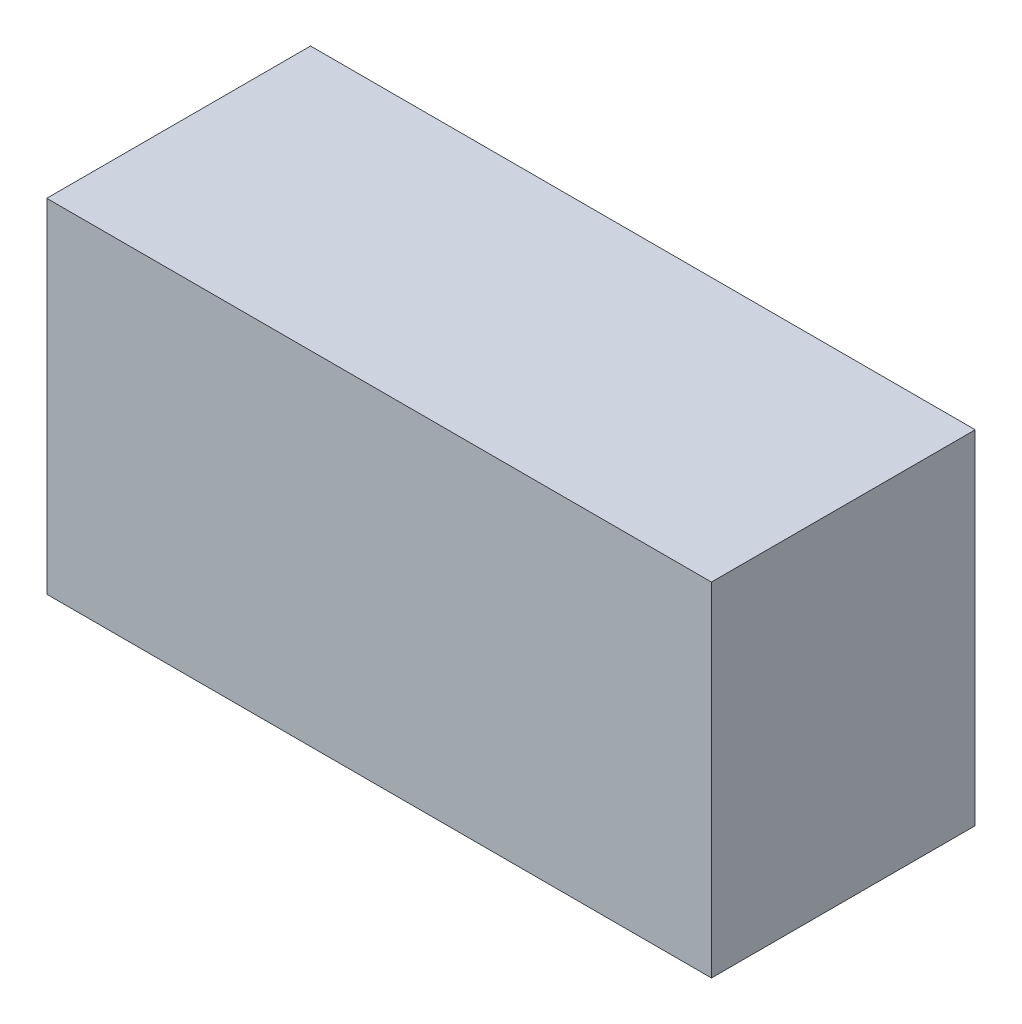
ISO-10303-21;
HEADER;
FILE_DESCRIPTION(('STEP AP214'),'2;1');
FILE_NAME('part.step','',(''),(''),'','','');
FILE_SCHEMA(('AUTOMOTIVE_DESIGN { 1 0 10303 214 1 1 1 1 }'));
ENDSEC;
DATA;
#1=APPLICATION_CONTEXT('core data for automotive mechanical design processes');
#2=APPLICATION_PROTOCOL_DEFINITION('international standard','automotive_design',2000,#1);
#3=PRODUCT_CONTEXT('',#1,'mechanical');
#4=PRODUCT('Part','Part','',(#3));
#5=PRODUCT_RELATED_PRODUCT_CATEGORY('part','',(#4));
#6=PRODUCT_DEFINITION_FORMATION('','',#4);
#7=PRODUCT_DEFINITION_CONTEXT('part definition',#1,'design');
#8=PRODUCT_DEFINITION('design','',#6,#7);
#9=PRODUCT_DEFINITION_SHAPE('','',#8);
#10=(LENGTH_UNIT() NAMED_UNIT(*) SI_UNIT(.MILLI.,.METRE.));
#11=(NAMED_UNIT(*) PLANE_ANGLE_UNIT() SI_UNIT($,.RADIAN.));
#12=(NAMED_UNIT(*) SI_UNIT($,.STERADIAN.) SOLID_ANGLE_UNIT());
#13=UNCERTAINTY_MEASURE_WITH_UNIT(LENGTH_MEASURE(1.E-05),#10,'distance_accuracy_value','');
#14=(GEOMETRIC_REPRESENTATION_CONTEXT(3) GLOBAL_UNCERTAINTY_ASSIGNED_CONTEXT((#13)) GLOBAL_UNIT_ASSIGNED_CONTEXT((#10,
#11,#12)) REPRESENTATION_CONTEXT('',''));
#15=CARTESIAN_POINT('',(0.,0.,0.));
#16=DIRECTION('',(0.,0.,1.));
#17=DIRECTION('',(1.,0.,0.));
#18=AXIS2_PLACEMENT_3D('',#15,#16,#17);
#19=CARTESIAN_POINT('',(81.4604305157735,127.283438744913,179.01));
#20=DIRECTION('',(0.999999999992343,-3.91342340034117E-06,0.));
#21=DIRECTION('',(-3.91342340034117E-06,-0.999999999992343,0.));
#22=AXIS2_PLACEMENT_3D('',#19,#20,#21);
#23=PLANE('',#22);
#24=DIRECTION('',(-3.91342339410265E-06,-0.999999999992343,0.));
#25=VECTOR('',#24,1.);
#26=CARTESIAN_POINT('',(81.4604304766392,127.273438744913,173.));
#27=LINE('',#26,#25);
#28=CARTESIAN_POINT('',(81.4604304766392,127.273438744913,173.));
#29=VERTEX_POINT('',#28);
#30=CARTESIAN_POINT('',(81.4603999519367,119.473438744973,173.));
#31=VERTEX_POINT('',#30);
#32=EDGE_CURVE('E71',#29,#31,#27,.T.);
#33=ORIENTED_EDGE('',*,*,#32,.F.);
#34=DIRECTION('',(0.,0.,-1.));
#35=VECTOR('',#34,1.);
#36=CARTESIAN_POINT('',(81.4604304766392,127.273438744913,176.));
#37=LINE('',#36,#35);
#38=CARTESIAN_POINT('',(81.4604304766392,127.273438744913,179.));
#39=VERTEX_POINT('',#38);
#40=EDGE_CURVE('E61',#39,#29,#37,.T.);
#41=ORIENTED_EDGE('',*,*,#40,.F.);
#42=DIRECTION('',(3.91342339410265E-06,0.999999999992343,0.));
#43=VECTOR('',#42,1.);
#44=CARTESIAN_POINT('',(81.4603999519367,119.473438744973,179.));
#45=LINE('',#44,#43);
#46=CARTESIAN_POINT('',(81.4603999519367,119.473438744973,179.));
#47=VERTEX_POINT('',#46);
#48=EDGE_CURVE('E21',#47,#39,#45,.T.);
#49=ORIENTED_EDGE('',*,*,#48,.F.);
#50=DIRECTION('',(0.,0.,1.));
#51=VECTOR('',#50,1.);
#52=CARTESIAN_POINT('',(81.4603999519367,119.473438744973,176.));
#53=LINE('',#52,#51);
#54=EDGE_CURVE('E60',#31,#47,#53,.T.);
#55=ORIENTED_EDGE('',*,*,#54,.F.);
#56=EDGE_LOOP('',(#33,#41,#49,#55));
#57=FACE_BOUND('',#56,.T.);
#58=ADVANCED_FACE('F17',(#57),#23,.T.);
#59=CARTESIAN_POINT('',(66.3303999520525,119.463438744973,179.));
#60=DIRECTION('',(0.,0.,1.));
#61=DIRECTION('',(1.,0.,0.));
#62=AXIS2_PLACEMENT_3D('',#59,#60,#61);
#63=PLANE('',#62);
#64=DIRECTION('',(-0.999999999992343,3.91342338232027E-06,0.));
#65=VECTOR('',#64,1.);
#66=CARTESIAN_POINT('',(73.9003999519945,119.473468330454,179.));
#67=LINE('',#66,#65);
#68=CARTESIAN_POINT('',(66.3403999520525,119.473497918435,179.));
#69=VERTEX_POINT('',#68);
#70=EDGE_CURVE('E66',#47,#69,#67,.T.);
#71=ORIENTED_EDGE('',*,*,#70,.F.);
#72=ORIENTED_EDGE('',*,*,#48,.T.);
#73=DIRECTION('',(0.999999999992342,-3.91342338323691E-06,0.));
#74=VECTOR('',#73,1.);
#75=CARTESIAN_POINT('',(73.9004304766971,127.273468330394,179.));
#76=LINE('',#75,#74);
#77=CARTESIAN_POINT('',(66.340430479255,127.273497915875,179.));
#78=VERTEX_POINT('',#77);
#79=EDGE_CURVE('E64',#78,#39,#76,.T.);
#80=ORIENTED_EDGE('',*,*,#79,.F.);
#81=DIRECTION('',(3.91342339856651E-06,0.999999999992343,0.));
#82=VECTOR('',#81,1.);
#83=CARTESIAN_POINT('',(66.3404152144037,123.373497915905,179.));
#84=LINE('',#83,#82);
#85=EDGE_CURVE('E69',#69,#78,#84,.T.);
#86=ORIENTED_EDGE('',*,*,#85,.F.);
#87=EDGE_LOOP('',(#71,#72,#80,#86));
#88=FACE_BOUND('',#87,.T.);
#89=ADVANCED_FACE('F67',(#88),#63,.T.);
#90=CARTESIAN_POINT('',(66.3304304767551,127.273497955009,179.01));
#91=DIRECTION('',(3.91342338323691E-06,0.999999999992343,0.));
#92=DIRECTION('',(0.999999999992343,-3.91342338323691E-06,0.));
#93=AXIS2_PLACEMENT_3D('',#90,#91,#92);
#94=PLANE('',#93);
#95=DIRECTION('',(0.999999999992342,-3.91342341212049E-06,0.));
#96=VECTOR('',#95,1.);
#97=CARTESIAN_POINT('',(66.340430476755,127.273497915875,173.));
#98=LINE('',#97,#96);
#99=CARTESIAN_POINT('',(66.340430476755,127.273497915875,173.));
#100=VERTEX_POINT('',#99);
#101=EDGE_CURVE('E80',#100,#29,#98,.T.);
#102=ORIENTED_EDGE('',*,*,#101,.F.);
#103=DIRECTION('',(0.,0.,-1.));
#104=VECTOR('',#103,1.);
#105=CARTESIAN_POINT('',(66.340430476755,127.273497915875,176.));
#106=LINE('',#105,#104);
#107=EDGE_CURVE('E75',#78,#100,#106,.T.);
#108=ORIENTED_EDGE('',*,*,#107,.F.);
#109=ORIENTED_EDGE('',*,*,#79,.T.);
#110=ORIENTED_EDGE('',*,*,#40,.T.);
#111=EDGE_LOOP('',(#102,#108,#109,#110));
#112=FACE_BOUND('',#111,.T.);
#113=ADVANCED_FACE('F90',(#112),#94,.T.);
#114=CARTESIAN_POINT('',(81.4704304766392,119.463438744973,173.));
#115=DIRECTION('',(0.,0.,-1.));
#116=DIRECTION('',(-1.,0.,0.));
#117=AXIS2_PLACEMENT_3D('',#114,#115,#116);
#118=PLANE('',#117);
#119=DIRECTION('',(0.999999999992342,-3.91342338232028E-06,0.));
#120=VECTOR('',#119,1.);
#121=CARTESIAN_POINT('',(73.9003999519945,119.473468330454,173.));
#122=LINE('',#121,#120);
#123=CARTESIAN_POINT('',(66.3403999545525,119.473497915935,173.));
#124=VERTEX_POINT('',#123);
#125=EDGE_CURVE('E36',#124,#31,#122,.T.);
#126=ORIENTED_EDGE('',*,*,#125,.F.);
#127=DIRECTION('',(-3.91342339856651E-06,-0.999999999992343,0.));
#128=VECTOR('',#127,1.);
#129=CARTESIAN_POINT('',(66.3404152144037,123.373497915905,173.));
#130=LINE('',#129,#128);
#131=EDGE_CURVE('E27',#100,#124,#130,.T.);
#132=ORIENTED_EDGE('',*,*,#131,.F.);
#133=ORIENTED_EDGE('',*,*,#101,.T.);
#134=ORIENTED_EDGE('',*,*,#32,.T.);
#135=EDGE_LOOP('',(#126,#132,#133,#134));
#136=FACE_BOUND('',#135,.T.);
#137=ADVANCED_FACE('F87',(#136),#118,.T.);
#138=CARTESIAN_POINT('',(81.4703999519366,119.473438705839,179.01));
#139=DIRECTION('',(-3.91342338232028E-06,-0.999999999992343,0.));
#140=DIRECTION('',(-0.999999999992343,3.91342338232028E-06,0.));
#141=AXIS2_PLACEMENT_3D('',#138,#139,#140);
#142=PLANE('',#141);
#143=ORIENTED_EDGE('',*,*,#125,.T.);
#144=ORIENTED_EDGE('',*,*,#54,.T.);
#145=ORIENTED_EDGE('',*,*,#70,.T.);
#146=DIRECTION('',(0.,0.,1.));
#147=VECTOR('',#146,1.);
#148=CARTESIAN_POINT('',(66.3403999520525,119.473497915935,176.));
#149=LINE('',#148,#147);
#150=EDGE_CURVE('E11',#124,#69,#149,.T.);
#151=ORIENTED_EDGE('',*,*,#150,.F.);
#152=EDGE_LOOP('',(#143,#144,#145,#151));
#153=FACE_BOUND('',#152,.T.);
#154=ADVANCED_FACE('F73',(#153),#142,.T.);
#155=CARTESIAN_POINT('',(66.3403999129182,119.463497915935,179.01));
#156=DIRECTION('',(-0.999999999992343,3.91342339856651E-06,0.));
#157=DIRECTION('',(3.91342339856651E-06,0.999999999992343,0.));
#158=AXIS2_PLACEMENT_3D('',#155,#156,#157);
#159=PLANE('',#158);
#160=ORIENTED_EDGE('',*,*,#131,.T.);
#161=ORIENTED_EDGE('',*,*,#150,.T.);
#162=ORIENTED_EDGE('',*,*,#85,.T.);
#163=ORIENTED_EDGE('',*,*,#107,.T.);
#164=EDGE_LOOP('',(#160,#161,#162,#163));
#165=FACE_BOUND('',#164,.T.);
#166=ADVANCED_FACE('F19',(#165),#159,.T.);
#167=CLOSED_SHELL('',(#58,#89,#113,#137,#154,#166));
#168=MANIFOLD_SOLID_BREP('B1',#167);
#169=ADVANCED_BREP_SHAPE_REPRESENTATION('',(#18,#168),#14);
#170=SHAPE_DEFINITION_REPRESENTATION(#9,#169);
ENDSEC;
END-ISO-10303-21;
